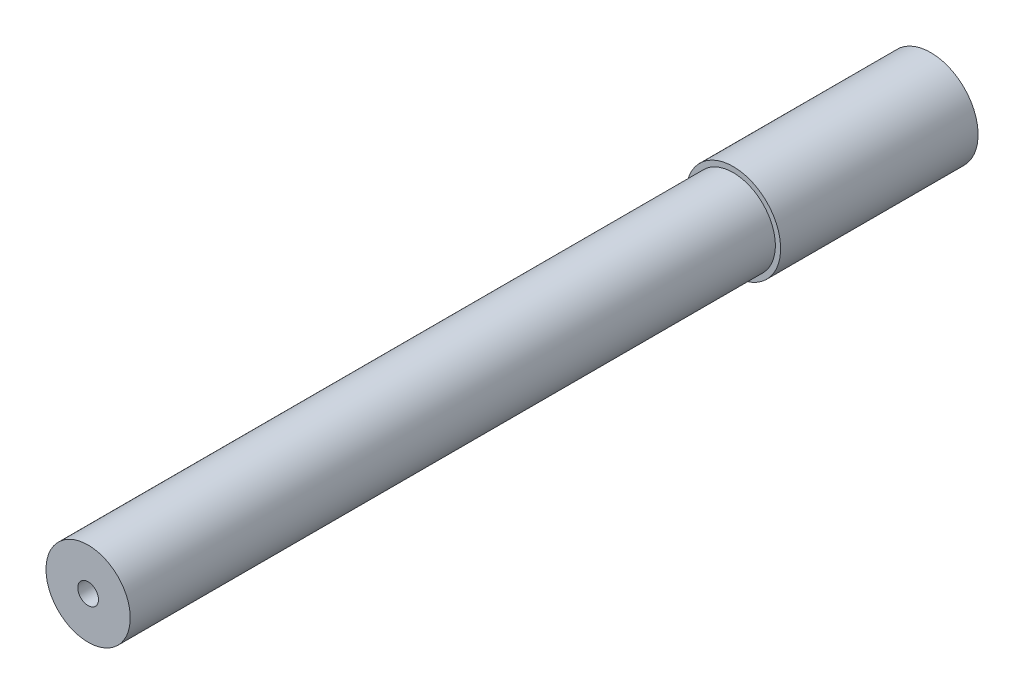
ISO-10303-21;
HEADER;
FILE_DESCRIPTION(('STEP AP214'),'2;1');
FILE_NAME('part.step','',(''),(''),'','','');
FILE_SCHEMA(('AUTOMOTIVE_DESIGN { 1 0 10303 214 1 1 1 1 }'));
ENDSEC;
DATA;
#1=APPLICATION_CONTEXT('core data for automotive mechanical design processes');
#2=APPLICATION_PROTOCOL_DEFINITION('international standard','automotive_design',2000,#1);
#3=PRODUCT_CONTEXT('',#1,'mechanical');
#4=PRODUCT('Part','Part','',(#3));
#5=PRODUCT_RELATED_PRODUCT_CATEGORY('part','',(#4));
#6=PRODUCT_DEFINITION_FORMATION('','',#4);
#7=PRODUCT_DEFINITION_CONTEXT('part definition',#1,'design');
#8=PRODUCT_DEFINITION('design','',#6,#7);
#9=PRODUCT_DEFINITION_SHAPE('','',#8);
#10=(LENGTH_UNIT() NAMED_UNIT(*) SI_UNIT(.MILLI.,.METRE.));
#11=(NAMED_UNIT(*) PLANE_ANGLE_UNIT() SI_UNIT($,.RADIAN.));
#12=(NAMED_UNIT(*) SI_UNIT($,.STERADIAN.) SOLID_ANGLE_UNIT());
#13=UNCERTAINTY_MEASURE_WITH_UNIT(LENGTH_MEASURE(1.E-05),#10,'distance_accuracy_value','');
#14=(GEOMETRIC_REPRESENTATION_CONTEXT(3) GLOBAL_UNCERTAINTY_ASSIGNED_CONTEXT((#13)) GLOBAL_UNIT_ASSIGNED_CONTEXT((#10,
#11,#12)) REPRESENTATION_CONTEXT('',''));
#15=CARTESIAN_POINT('',(0.,0.,0.));
#16=DIRECTION('',(0.,0.,1.));
#17=DIRECTION('',(1.,0.,0.));
#18=AXIS2_PLACEMENT_3D('',#15,#16,#17);
#19=CARTESIAN_POINT('',(0.,0.,38.1));
#20=DIRECTION('',(0.,0.,-1.));
#21=DIRECTION('',(-1.,0.,0.));
#22=AXIS2_PLACEMENT_3D('',#19,#20,#21);
#23=CYLINDRICAL_SURFACE('',#22,9.144);
#24=CARTESIAN_POINT('',(0.,0.,38.1));
#25=DIRECTION('',(0.,0.,1.));
#26=DIRECTION('',(1.,0.,0.));
#27=AXIS2_PLACEMENT_3D('',#24,#25,#26);
#28=CIRCLE('',#27,9.144);
#29=CARTESIAN_POINT('',(-9.144,0.,38.1));
#30=VERTEX_POINT('',#29);
#31=EDGE_CURVE('E40',#30,#30,#28,.T.);
#32=CARTESIAN_POINT('',(0.,0.,0.));
#33=DIRECTION('',(0.,0.,1.));
#34=DIRECTION('',(1.,0.,0.));
#35=AXIS2_PLACEMENT_3D('',#32,#33,#34);
#36=CIRCLE('',#35,9.144);
#37=CARTESIAN_POINT('',(-9.144,0.,0.));
#38=VERTEX_POINT('',#37);
#39=EDGE_CURVE('E36',#38,#38,#36,.T.);
#40=CARTESIAN_POINT('',(-9.144,0.,38.1));
#41=CARTESIAN_POINT('',(-9.144,0.,37.703125));
#42=CARTESIAN_POINT('',(-9.144,0.,37.30625));
#43=CARTESIAN_POINT('',(-9.144,0.,36.5125));
#44=CARTESIAN_POINT('',(-9.144,0.,36.115625));
#45=CARTESIAN_POINT('',(-9.144,0.,35.321875));
#46=CARTESIAN_POINT('',(-9.144,0.,34.925));
#47=CARTESIAN_POINT('',(-9.144,0.,34.13125));
#48=CARTESIAN_POINT('',(-9.144,0.,33.734375));
#49=CARTESIAN_POINT('',(-9.144,0.,32.940625));
#50=CARTESIAN_POINT('',(-9.144,0.,32.54375));
#51=CARTESIAN_POINT('',(-9.144,0.,31.75));
#52=CARTESIAN_POINT('',(-9.144,0.,31.353125));
#53=CARTESIAN_POINT('',(-9.144,0.,30.559375));
#54=CARTESIAN_POINT('',(-9.144,0.,30.1625));
#55=CARTESIAN_POINT('',(-9.144,0.,29.36875));
#56=CARTESIAN_POINT('',(-9.144,0.,28.971875));
#57=CARTESIAN_POINT('',(-9.144,0.,28.178125));
#58=CARTESIAN_POINT('',(-9.144,0.,27.78125));
#59=CARTESIAN_POINT('',(-9.144,0.,26.9875));
#60=CARTESIAN_POINT('',(-9.144,0.,26.590625));
#61=CARTESIAN_POINT('',(-9.144,0.,25.796875));
#62=CARTESIAN_POINT('',(-9.144,0.,25.4));
#63=CARTESIAN_POINT('',(-9.144,0.,24.60625));
#64=CARTESIAN_POINT('',(-9.144,0.,24.209375));
#65=CARTESIAN_POINT('',(-9.144,0.,23.415625));
#66=CARTESIAN_POINT('',(-9.144,0.,23.01875));
#67=CARTESIAN_POINT('',(-9.144,0.,22.225));
#68=CARTESIAN_POINT('',(-9.144,0.,21.828125));
#69=CARTESIAN_POINT('',(-9.144,0.,21.034375));
#70=CARTESIAN_POINT('',(-9.144,0.,20.6375));
#71=CARTESIAN_POINT('',(-9.144,0.,19.84375));
#72=CARTESIAN_POINT('',(-9.144,0.,19.446875));
#73=CARTESIAN_POINT('',(-9.144,0.,18.653125));
#74=CARTESIAN_POINT('',(-9.144,0.,18.25625));
#75=CARTESIAN_POINT('',(-9.144,0.,17.4625));
#76=CARTESIAN_POINT('',(-9.144,0.,17.065625));
#77=CARTESIAN_POINT('',(-9.144,0.,16.271875));
#78=CARTESIAN_POINT('',(-9.144,0.,15.875));
#79=CARTESIAN_POINT('',(-9.144,0.,15.08125));
#80=CARTESIAN_POINT('',(-9.144,0.,14.684375));
#81=CARTESIAN_POINT('',(-9.144,0.,13.890625));
#82=CARTESIAN_POINT('',(-9.144,0.,13.49375));
#83=CARTESIAN_POINT('',(-9.144,0.,12.7));
#84=CARTESIAN_POINT('',(-9.144,0.,12.303125));
#85=CARTESIAN_POINT('',(-9.144,0.,11.509375));
#86=CARTESIAN_POINT('',(-9.144,0.,11.1125));
#87=CARTESIAN_POINT('',(-9.144,0.,10.31875));
#88=CARTESIAN_POINT('',(-9.144,0.,9.921875));
#89=CARTESIAN_POINT('',(-9.144,0.,9.128125));
#90=CARTESIAN_POINT('',(-9.144,0.,8.73125));
#91=CARTESIAN_POINT('',(-9.144,0.,7.9375));
#92=CARTESIAN_POINT('',(-9.144,0.,7.540625));
#93=CARTESIAN_POINT('',(-9.144,0.,6.746875));
#94=CARTESIAN_POINT('',(-9.144,0.,6.35));
#95=CARTESIAN_POINT('',(-9.144,0.,5.55625));
#96=CARTESIAN_POINT('',(-9.144,0.,5.159375));
#97=CARTESIAN_POINT('',(-9.144,0.,4.365625));
#98=CARTESIAN_POINT('',(-9.144,0.,3.96875));
#99=CARTESIAN_POINT('',(-9.144,0.,3.175));
#100=CARTESIAN_POINT('',(-9.144,0.,2.778125));
#101=CARTESIAN_POINT('',(-9.144,0.,1.984375));
#102=CARTESIAN_POINT('',(-9.144,0.,1.5875));
#103=CARTESIAN_POINT('',(-9.144,0.,0.79375));
#104=CARTESIAN_POINT('',(-9.144,0.,0.396875));
#105=CARTESIAN_POINT('',(-9.144,0.,0.));
#106=B_SPLINE_CURVE_WITH_KNOTS('',3,(#40,#41,#42,#43,#44,#45,#46,#47,#48,#49,#50,#51,#52,#53,
#54,#55,#56,#57,#58,#59,#60,#61,#62,#63,#64,#65,#66,#67,#68,#69,#70,#71,#72,#73,#74,#75,#76,#77,
#78,#79,#80,#81,#82,#83,#84,#85,#86,#87,#88,#89,#90,#91,#92,#93,#94,#95,#96,#97,#98,#99,#100,
#101,#102,#103,#104,#105),.UNSPECIFIED.,.F.,.F.,(4,2,2,2,2,2,2,2,2,2,2,2,2,2,2,2,2,2,2,2,2,2,2,
2,2,2,2,2,2,2,2,2,4),(0.,1.19062499999999,2.38124999999999,3.571875,4.7625,5.953125,7.14375,
8.33437499999999,9.525,10.715625,11.90625,13.096875,14.2875,15.478125,16.66875,17.859375,19.05,
20.240625,21.43125,22.621875,23.8125,25.003125,26.19375,27.384375,28.575,29.765625,30.95625,
32.146875,33.3375,34.528125,35.71875,36.909375,38.1),.UNSPECIFIED.);
#107=EDGE_CURVE('BSEAM33',#30,#38,#106,.T.);
#108=ORIENTED_EDGE('',*,*,#31,.F.);
#109=ORIENTED_EDGE('',*,*,#39,.T.);
#110=ORIENTED_EDGE('',*,*,#107,.T.);
#111=ORIENTED_EDGE('',*,*,#107,.F.);
#112=EDGE_LOOP('',(#108,#110,#109,#111));
#113=FACE_BOUND('',#112,.T.);
#114=ADVANCED_FACE('F33',(#113),#23,.T.);
#115=CARTESIAN_POINT('',(0.,0.,38.1));
#116=DIRECTION('',(0.,0.,1.));
#117=DIRECTION('',(1.,0.,0.));
#118=AXIS2_PLACEMENT_3D('',#115,#116,#117);
#119=PLANE('',#118);
#120=CARTESIAN_POINT('',(0.,0.,38.1));
#121=DIRECTION('',(0.,0.,1.));
#122=DIRECTION('',(1.,0.,0.));
#123=AXIS2_PLACEMENT_3D('',#120,#121,#122);
#124=CIRCLE('',#123,8.128);
#125=CARTESIAN_POINT('',(-8.128,0.,38.1));
#126=VERTEX_POINT('',#125);
#127=EDGE_CURVE('E10',#126,#126,#124,.T.);
#128=ORIENTED_EDGE('',*,*,#127,.F.);
#129=EDGE_LOOP('',(#128));
#130=FACE_BOUND('',#129,.T.);
#131=ORIENTED_EDGE('',*,*,#31,.T.);
#132=EDGE_LOOP('',(#131));
#133=FACE_BOUND('',#132,.T.);
#134=ADVANCED_FACE('F77',(#130,#133),#119,.T.);
#135=CARTESIAN_POINT('',(0.,0.,0.));
#136=DIRECTION('',(0.,0.,1.));
#137=DIRECTION('',(1.,0.,0.));
#138=AXIS2_PLACEMENT_3D('',#135,#136,#137);
#139=PLANE('',#138);
#140=ORIENTED_EDGE('',*,*,#39,.F.);
#141=EDGE_LOOP('',(#140));
#142=FACE_BOUND('',#141,.T.);
#143=ADVANCED_FACE('F72',(#142),#139,.F.);
#144=CARTESIAN_POINT('',(0.,0.,162.56));
#145=DIRECTION('',(0.,0.,-1.));
#146=DIRECTION('',(-1.,0.,0.));
#147=AXIS2_PLACEMENT_3D('',#144,#145,#146);
#148=CYLINDRICAL_SURFACE('',#147,8.128);
#149=CARTESIAN_POINT('',(0.,0.,162.56));
#150=DIRECTION('',(0.,0.,1.));
#151=DIRECTION('',(1.,0.,0.));
#152=AXIS2_PLACEMENT_3D('',#149,#150,#151);
#153=CIRCLE('',#152,8.128);
#154=CARTESIAN_POINT('',(-8.128,0.,162.56));
#155=VERTEX_POINT('',#154);
#156=EDGE_CURVE('E46',#155,#155,#153,.T.);
#157=CARTESIAN_POINT('',(-8.128,0.,162.56));
#158=CARTESIAN_POINT('',(-8.128,0.,161.263541666667));
#159=CARTESIAN_POINT('',(-8.128,0.,159.967083333333));
#160=CARTESIAN_POINT('',(-8.128,0.,157.374166666667));
#161=CARTESIAN_POINT('',(-8.128,0.,156.077708333333));
#162=CARTESIAN_POINT('',(-8.128,0.,153.484791666667));
#163=CARTESIAN_POINT('',(-8.128,0.,152.188333333333));
#164=CARTESIAN_POINT('',(-8.128,0.,149.595416666667));
#165=CARTESIAN_POINT('',(-8.128,0.,148.298958333333));
#166=CARTESIAN_POINT('',(-8.128,0.,145.706041666667));
#167=CARTESIAN_POINT('',(-8.128,0.,144.409583333333));
#168=CARTESIAN_POINT('',(-8.128,0.,141.816666666667));
#169=CARTESIAN_POINT('',(-8.128,0.,140.520208333333));
#170=CARTESIAN_POINT('',(-8.128,0.,137.927291666667));
#171=CARTESIAN_POINT('',(-8.128,0.,136.630833333333));
#172=CARTESIAN_POINT('',(-8.128,0.,134.037916666667));
#173=CARTESIAN_POINT('',(-8.128,0.,132.741458333333));
#174=CARTESIAN_POINT('',(-8.128,0.,130.148541666667));
#175=CARTESIAN_POINT('',(-8.128,0.,128.852083333333));
#176=CARTESIAN_POINT('',(-8.128,0.,126.259166666667));
#177=CARTESIAN_POINT('',(-8.128,0.,124.962708333333));
#178=CARTESIAN_POINT('',(-8.128,0.,122.369791666667));
#179=CARTESIAN_POINT('',(-8.128,0.,121.073333333333));
#180=CARTESIAN_POINT('',(-8.128,0.,118.480416666667));
#181=CARTESIAN_POINT('',(-8.128,0.,117.183958333333));
#182=CARTESIAN_POINT('',(-8.128,0.,114.591041666667));
#183=CARTESIAN_POINT('',(-8.128,0.,113.294583333333));
#184=CARTESIAN_POINT('',(-8.128,0.,110.701666666667));
#185=CARTESIAN_POINT('',(-8.128,0.,109.405208333333));
#186=CARTESIAN_POINT('',(-8.128,0.,106.812291666667));
#187=CARTESIAN_POINT('',(-8.128,0.,105.515833333333));
#188=CARTESIAN_POINT('',(-8.128,0.,102.922916666667));
#189=CARTESIAN_POINT('',(-8.128,0.,101.626458333333));
#190=CARTESIAN_POINT('',(-8.128,0.,99.0335416666667));
#191=CARTESIAN_POINT('',(-8.128,0.,97.7370833333333));
#192=CARTESIAN_POINT('',(-8.128,0.,95.1441666666667));
#193=CARTESIAN_POINT('',(-8.128,0.,93.8477083333333));
#194=CARTESIAN_POINT('',(-8.128,0.,91.2547916666667));
#195=CARTESIAN_POINT('',(-8.128,0.,89.9583333333333));
#196=CARTESIAN_POINT('',(-8.128,0.,87.3654166666667));
#197=CARTESIAN_POINT('',(-8.128,0.,86.0689583333333));
#198=CARTESIAN_POINT('',(-8.128,0.,83.4760416666667));
#199=CARTESIAN_POINT('',(-8.128,0.,82.1795833333333));
#200=CARTESIAN_POINT('',(-8.128,0.,79.5866666666667));
#201=CARTESIAN_POINT('',(-8.128,0.,78.2902083333334));
#202=CARTESIAN_POINT('',(-8.128,0.,75.6972916666667));
#203=CARTESIAN_POINT('',(-8.128,0.,74.4008333333334));
#204=CARTESIAN_POINT('',(-8.128,0.,71.8079166666667));
#205=CARTESIAN_POINT('',(-8.128,0.,70.5114583333334));
#206=CARTESIAN_POINT('',(-8.128,0.,67.9185416666667));
#207=CARTESIAN_POINT('',(-8.128,0.,66.6220833333334));
#208=CARTESIAN_POINT('',(-8.128,0.,64.0291666666667));
#209=CARTESIAN_POINT('',(-8.128,0.,62.7327083333333));
#210=CARTESIAN_POINT('',(-8.128,0.,60.1397916666667));
#211=CARTESIAN_POINT('',(-8.128,0.,58.8433333333333));
#212=CARTESIAN_POINT('',(-8.128,0.,56.2504166666667));
#213=CARTESIAN_POINT('',(-8.128,0.,54.9539583333333));
#214=CARTESIAN_POINT('',(-8.128,0.,52.3610416666667));
#215=CARTESIAN_POINT('',(-8.128,0.,51.0645833333333));
#216=CARTESIAN_POINT('',(-8.128,0.,48.4716666666667));
#217=CARTESIAN_POINT('',(-8.128,0.,47.1752083333333));
#218=CARTESIAN_POINT('',(-8.128,0.,44.5822916666667));
#219=CARTESIAN_POINT('',(-8.128,0.,43.2858333333333));
#220=CARTESIAN_POINT('',(-8.128,0.,40.6929166666667));
#221=CARTESIAN_POINT('',(-8.128,0.,39.3964583333333));
#222=CARTESIAN_POINT('',(-8.128,0.,38.1));
#223=B_SPLINE_CURVE_WITH_KNOTS('',3,(#157,#158,#159,#160,#161,#162,#163,#164,#165,#166,#167,
#168,#169,#170,#171,#172,#173,#174,#175,#176,#177,#178,#179,#180,#181,#182,#183,#184,#185,#186,
#187,#188,#189,#190,#191,#192,#193,#194,#195,#196,#197,#198,#199,#200,#201,#202,#203,#204,#205,
#206,#207,#208,#209,#210,#211,#212,#213,#214,#215,#216,#217,#218,#219,#220,#221,#222),
.UNSPECIFIED.,.F.,.F.,(4,2,2,2,2,2,2,2,2,2,2,2,2,2,2,2,2,2,2,2,2,2,2,2,2,2,2,2,2,2,2,2,4),(0.,
3.88937499999997,7.77874999999997,11.668125,15.5575,19.446875,23.33625,27.225625,31.115,
35.004375,38.89375,42.783125,46.6725,50.561875,54.45125,58.340625,62.23,66.119375,70.00875,
73.898125,77.7875,81.676875,85.56625,89.455625,93.345,97.234375,101.12375,105.013125,108.9025,
112.791875,116.68125,120.570625,124.46),.UNSPECIFIED.);
#224=EDGE_CURVE('BSEAM67',#155,#126,#223,.T.);
#225=ORIENTED_EDGE('',*,*,#156,.F.);
#226=ORIENTED_EDGE('',*,*,#127,.T.);
#227=ORIENTED_EDGE('',*,*,#224,.T.);
#228=ORIENTED_EDGE('',*,*,#224,.F.);
#229=EDGE_LOOP('',(#225,#227,#226,#228));
#230=FACE_BOUND('',#229,.T.);
#231=ADVANCED_FACE('F67',(#230),#148,.T.);
#232=CARTESIAN_POINT('',(0.,0.,162.56));
#233=DIRECTION('',(0.,0.,1.));
#234=DIRECTION('',(1.,0.,0.));
#235=AXIS2_PLACEMENT_3D('',#232,#233,#234);
#236=PLANE('',#235);
#237=CARTESIAN_POINT('',(0.,0.,162.56));
#238=DIRECTION('',(0.,0.,1.));
#239=DIRECTION('',(1.,0.,0.));
#240=AXIS2_PLACEMENT_3D('',#237,#238,#239);
#241=CIRCLE('',#240,2.);
#242=CARTESIAN_POINT('',(2.,0.,162.56));
#243=VERTEX_POINT('',#242);
#244=EDGE_CURVE('E50',#243,#243,#241,.T.);
#245=ORIENTED_EDGE('',*,*,#244,.F.);
#246=EDGE_LOOP('',(#245));
#247=FACE_BOUND('',#246,.T.);
#248=ORIENTED_EDGE('',*,*,#156,.T.);
#249=EDGE_LOOP('',(#248));
#250=FACE_BOUND('',#249,.T.);
#251=ADVANCED_FACE('F61',(#247,#250),#236,.T.);
#252=CARTESIAN_POINT('',(0.,0.,143.51));
#253=DIRECTION('',(0.,0.,1.));
#254=DIRECTION('',(1.,0.,0.));
#255=AXIS2_PLACEMENT_3D('',#252,#253,#254);
#256=CYLINDRICAL_SURFACE('',#255,2.);
#257=CARTESIAN_POINT('',(0.,0.,143.51));
#258=DIRECTION('',(0.,0.,1.));
#259=DIRECTION('',(1.,0.,0.));
#260=AXIS2_PLACEMENT_3D('',#257,#258,#259);
#261=CIRCLE('',#260,2.);
#262=CARTESIAN_POINT('',(2.,0.,143.51));
#263=VERTEX_POINT('',#262);
#264=EDGE_CURVE('E49',#263,#263,#261,.T.);
#265=CARTESIAN_POINT('',(2.,0.,143.51));
#266=CARTESIAN_POINT('',(2.,0.,143.7084375));
#267=CARTESIAN_POINT('',(2.,0.,143.906875));
#268=CARTESIAN_POINT('',(2.,0.,144.30375));
#269=CARTESIAN_POINT('',(2.,0.,144.5021875));
#270=CARTESIAN_POINT('',(2.,0.,144.8990625));
#271=CARTESIAN_POINT('',(2.,0.,145.0975));
#272=CARTESIAN_POINT('',(2.,0.,145.494375));
#273=CARTESIAN_POINT('',(2.,0.,145.6928125));
#274=CARTESIAN_POINT('',(2.,0.,146.0896875));
#275=CARTESIAN_POINT('',(2.,0.,146.288125));
#276=CARTESIAN_POINT('',(2.,0.,146.685));
#277=CARTESIAN_POINT('',(2.,0.,146.8834375));
#278=CARTESIAN_POINT('',(2.,0.,147.2803125));
#279=CARTESIAN_POINT('',(2.,0.,147.47875));
#280=CARTESIAN_POINT('',(2.,0.,147.875625));
#281=CARTESIAN_POINT('',(2.,0.,148.0740625));
#282=CARTESIAN_POINT('',(2.,0.,148.4709375));
#283=CARTESIAN_POINT('',(2.,0.,148.669375));
#284=CARTESIAN_POINT('',(2.,0.,149.06625));
#285=CARTESIAN_POINT('',(2.,0.,149.2646875));
#286=CARTESIAN_POINT('',(2.,0.,149.6615625));
#287=CARTESIAN_POINT('',(2.,0.,149.86));
#288=CARTESIAN_POINT('',(2.,0.,150.256875));
#289=CARTESIAN_POINT('',(2.,0.,150.4553125));
#290=CARTESIAN_POINT('',(2.,0.,150.8521875));
#291=CARTESIAN_POINT('',(2.,0.,151.050625));
#292=CARTESIAN_POINT('',(2.,0.,151.4475));
#293=CARTESIAN_POINT('',(2.,0.,151.6459375));
#294=CARTESIAN_POINT('',(2.,0.,152.0428125));
#295=CARTESIAN_POINT('',(2.,0.,152.24125));
#296=CARTESIAN_POINT('',(2.,0.,152.638125));
#297=CARTESIAN_POINT('',(2.,0.,152.8365625));
#298=CARTESIAN_POINT('',(2.,0.,153.2334375));
#299=CARTESIAN_POINT('',(2.,0.,153.431875));
#300=CARTESIAN_POINT('',(2.,0.,153.82875));
#301=CARTESIAN_POINT('',(2.,0.,154.0271875));
#302=CARTESIAN_POINT('',(2.,0.,154.4240625));
#303=CARTESIAN_POINT('',(2.,0.,154.6225));
#304=CARTESIAN_POINT('',(2.,0.,155.019375));
#305=CARTESIAN_POINT('',(2.,0.,155.2178125));
#306=CARTESIAN_POINT('',(2.,0.,155.6146875));
#307=CARTESIAN_POINT('',(2.,0.,155.813125));
#308=CARTESIAN_POINT('',(2.,0.,156.21));
#309=CARTESIAN_POINT('',(2.,0.,156.4084375));
#310=CARTESIAN_POINT('',(2.,0.,156.8053125));
#311=CARTESIAN_POINT('',(2.,0.,157.00375));
#312=CARTESIAN_POINT('',(2.,0.,157.400625));
#313=CARTESIAN_POINT('',(2.,0.,157.5990625));
#314=CARTESIAN_POINT('',(2.,0.,157.9959375));
#315=CARTESIAN_POINT('',(2.,0.,158.194375));
#316=CARTESIAN_POINT('',(2.,0.,158.59125));
#317=CARTESIAN_POINT('',(2.,0.,158.7896875));
#318=CARTESIAN_POINT('',(2.,0.,159.1865625));
#319=CARTESIAN_POINT('',(2.,0.,159.385));
#320=CARTESIAN_POINT('',(2.,0.,159.781875));
#321=CARTESIAN_POINT('',(2.,0.,159.9803125));
#322=CARTESIAN_POINT('',(2.,0.,160.3771875));
#323=CARTESIAN_POINT('',(2.,0.,160.575625));
#324=CARTESIAN_POINT('',(2.,0.,160.9725));
#325=CARTESIAN_POINT('',(2.,0.,161.1709375));
#326=CARTESIAN_POINT('',(2.,0.,161.5678125));
#327=CARTESIAN_POINT('',(2.,0.,161.76625));
#328=CARTESIAN_POINT('',(2.,0.,162.163125));
#329=CARTESIAN_POINT('',(2.,0.,162.3615625));
#330=CARTESIAN_POINT('',(2.,0.,162.56));
#331=B_SPLINE_CURVE_WITH_KNOTS('',3,(#265,#266,#267,#268,#269,#270,#271,#272,#273,#274,#275,
#276,#277,#278,#279,#280,#281,#282,#283,#284,#285,#286,#287,#288,#289,#290,#291,#292,#293,#294,
#295,#296,#297,#298,#299,#300,#301,#302,#303,#304,#305,#306,#307,#308,#309,#310,#311,#312,#313,
#314,#315,#316,#317,#318,#319,#320,#321,#322,#323,#324,#325,#326,#327,#328,#329,#330),
.UNSPECIFIED.,.F.,.F.,(4,2,2,2,2,2,2,2,2,2,2,2,2,2,2,2,2,2,2,2,2,2,2,2,2,2,2,2,2,2,2,2,4),(0.,
0.5953125,1.190625,1.7859375,2.38125,2.9765625,3.571875,4.1671875,4.7625,5.3578125,5.953125,
6.5484375,7.14375,7.7390625,8.334375,8.92968750000001,9.52500000000001,10.1203125,10.715625,
11.3109375,11.90625,12.5015625,13.096875,13.6921875,14.2875,14.8828125,15.478125,16.0734375,
16.66875,17.2640625,17.859375,18.4546875,19.05),.UNSPECIFIED.);
#332=EDGE_CURVE('BSEAM58',#263,#243,#331,.T.);
#333=ORIENTED_EDGE('',*,*,#264,.F.);
#334=ORIENTED_EDGE('',*,*,#244,.T.);
#335=ORIENTED_EDGE('',*,*,#332,.T.);
#336=ORIENTED_EDGE('',*,*,#332,.F.);
#337=EDGE_LOOP('',(#333,#335,#334,#336));
#338=FACE_BOUND('',#337,.T.);
#339=ADVANCED_FACE('F58',(#338),#256,.F.);
#340=CARTESIAN_POINT('',(0.,0.,143.51));
#341=DIRECTION('',(0.,0.,1.));
#342=DIRECTION('',(1.,0.,0.));
#343=AXIS2_PLACEMENT_3D('',#340,#341,#342);
#344=PLANE('',#343);
#345=ORIENTED_EDGE('',*,*,#264,.T.);
#346=EDGE_LOOP('',(#345));
#347=FACE_BOUND('',#346,.T.);
#348=ADVANCED_FACE('F56',(#347),#344,.T.);
#349=CLOSED_SHELL('',(#114,#134,#143,#231,#251,#339,#348));
#350=MANIFOLD_SOLID_BREP('B2',#349);
#351=ADVANCED_BREP_SHAPE_REPRESENTATION('',(#18,#350),#14);
#352=SHAPE_DEFINITION_REPRESENTATION(#9,#351);
ENDSEC;
END-ISO-10303-21;
